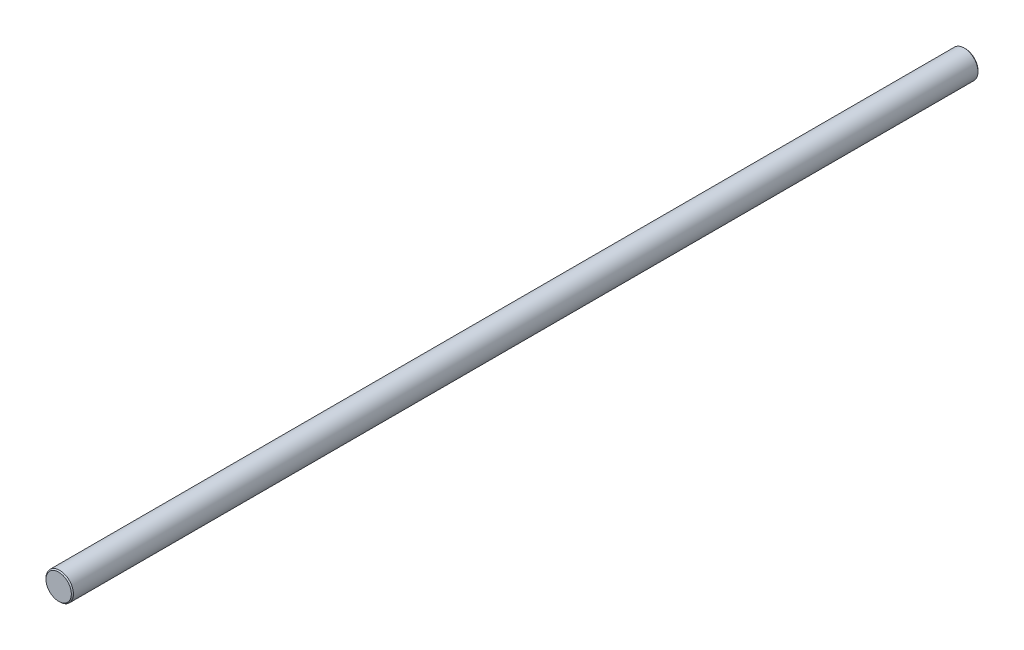
ISO-10303-21;
HEADER;
FILE_DESCRIPTION(('STEP AP214'),'2;1');
FILE_NAME('part.step','',(''),(''),'','','');
FILE_SCHEMA(('AUTOMOTIVE_DESIGN { 1 0 10303 214 1 1 1 1 }'));
ENDSEC;
DATA;
#1=APPLICATION_CONTEXT('core data for automotive mechanical design processes');
#2=APPLICATION_PROTOCOL_DEFINITION('international standard','automotive_design',2000,#1);
#3=PRODUCT_CONTEXT('',#1,'mechanical');
#4=PRODUCT('Part','Part','',(#3));
#5=PRODUCT_RELATED_PRODUCT_CATEGORY('part','',(#4));
#6=PRODUCT_DEFINITION_FORMATION('','',#4);
#7=PRODUCT_DEFINITION_CONTEXT('part definition',#1,'design');
#8=PRODUCT_DEFINITION('design','',#6,#7);
#9=PRODUCT_DEFINITION_SHAPE('','',#8);
#10=(LENGTH_UNIT() NAMED_UNIT(*) SI_UNIT(.MILLI.,.METRE.));
#11=(NAMED_UNIT(*) PLANE_ANGLE_UNIT() SI_UNIT($,.RADIAN.));
#12=(NAMED_UNIT(*) SI_UNIT($,.STERADIAN.) SOLID_ANGLE_UNIT());
#13=UNCERTAINTY_MEASURE_WITH_UNIT(LENGTH_MEASURE(1.E-05),#10,'distance_accuracy_value','');
#14=(GEOMETRIC_REPRESENTATION_CONTEXT(3) GLOBAL_UNCERTAINTY_ASSIGNED_CONTEXT((#13)) GLOBAL_UNIT_ASSIGNED_CONTEXT((#10,
#11,#12)) REPRESENTATION_CONTEXT('',''));
#15=CARTESIAN_POINT('',(0.,0.,0.));
#16=DIRECTION('',(0.,0.,1.));
#17=DIRECTION('',(1.,0.,0.));
#18=AXIS2_PLACEMENT_3D('',#15,#16,#17);
#19=CARTESIAN_POINT('',(0.,0.,330.2));
#20=DIRECTION('',(0.,0.,-1.));
#21=DIRECTION('',(-1.,0.,0.));
#22=AXIS2_PLACEMENT_3D('',#19,#20,#21);
#23=CYLINDRICAL_SURFACE('',#22,10.);
#24=CARTESIAN_POINT('',(0.,0.,-329.438));
#25=DIRECTION('',(0.,0.,1.));
#26=DIRECTION('',(1.,0.,0.));
#27=AXIS2_PLACEMENT_3D('',#24,#25,#26);
#28=CIRCLE('',#27,10.);
#29=CARTESIAN_POINT('',(10.,0.,-329.438));
#30=VERTEX_POINT('',#29);
#31=EDGE_CURVE('E41',#30,#30,#28,.T.);
#32=ORIENTED_EDGE('',*,*,#31,.T.);
#33=EDGE_LOOP('',(#32));
#34=FACE_BOUND('',#33,.T.);
#35=CARTESIAN_POINT('',(0.,0.,329.438));
#36=DIRECTION('',(0.,0.,1.));
#37=DIRECTION('',(1.,0.,0.));
#38=AXIS2_PLACEMENT_3D('',#35,#36,#37);
#39=CIRCLE('',#38,10.);
#40=CARTESIAN_POINT('',(10.,0.,329.438));
#41=VERTEX_POINT('',#40);
#42=EDGE_CURVE('E45',#41,#41,#39,.F.);
#43=ORIENTED_EDGE('',*,*,#42,.T.);
#44=EDGE_LOOP('',(#43));
#45=FACE_BOUND('',#44,.T.);
#46=ADVANCED_FACE('F30',(#34,#45),#23,.T.);
#47=CARTESIAN_POINT('',(0.,0.,330.2));
#48=DIRECTION('',(0.,0.,1.));
#49=DIRECTION('',(1.,0.,0.));
#50=AXIS2_PLACEMENT_3D('',#47,#48,#49);
#51=PLANE('',#50);
#52=CARTESIAN_POINT('',(0.,0.,330.2));
#53=DIRECTION('',(0.,0.,1.));
#54=DIRECTION('',(1.,0.,0.));
#55=AXIS2_PLACEMENT_3D('',#52,#53,#54);
#56=CIRCLE('',#55,9.23800000000002);
#57=CARTESIAN_POINT('',(9.23800000000002,0.,330.2));
#58=VERTEX_POINT('',#57);
#59=EDGE_CURVE('E10',#58,#58,#56,.T.);
#60=ORIENTED_EDGE('',*,*,#59,.T.);
#61=EDGE_LOOP('',(#60));
#62=FACE_BOUND('',#61,.T.);
#63=ADVANCED_FACE('F61',(#62),#51,.T.);
#64=CARTESIAN_POINT('',(0.,0.,-330.2));
#65=DIRECTION('',(0.,0.,1.));
#66=DIRECTION('',(1.,0.,0.));
#67=AXIS2_PLACEMENT_3D('',#64,#65,#66);
#68=PLANE('',#67);
#69=CARTESIAN_POINT('',(0.,0.,-330.2));
#70=DIRECTION('',(0.,0.,1.));
#71=DIRECTION('',(1.,0.,0.));
#72=AXIS2_PLACEMENT_3D('',#69,#70,#71);
#73=CIRCLE('',#72,9.23800000000025);
#74=CARTESIAN_POINT('',(9.23800000000025,0.,-330.2));
#75=VERTEX_POINT('',#74);
#76=EDGE_CURVE('E37',#75,#75,#73,.F.);
#77=ORIENTED_EDGE('',*,*,#76,.T.);
#78=EDGE_LOOP('',(#77));
#79=FACE_BOUND('',#78,.T.);
#80=ADVANCED_FACE('F58',(#79),#68,.F.);
#81=CARTESIAN_POINT('',(0.,0.,-329.438));
#82=DIRECTION('',(0.,0.,1.));
#83=DIRECTION('',(1.,0.,0.));
#84=AXIS2_PLACEMENT_3D('',#81,#82,#83);
#85=CONICAL_SURFACE('',#84,10.,0.785398163397406);
#86=ORIENTED_EDGE('',*,*,#76,.F.);
#87=EDGE_LOOP('',(#86));
#88=FACE_BOUND('',#87,.T.);
#89=ORIENTED_EDGE('',*,*,#31,.F.);
#90=EDGE_LOOP('',(#89));
#91=FACE_BOUND('',#90,.T.);
#92=ADVANCED_FACE('F54',(#88,#91),#85,.T.);
#93=CARTESIAN_POINT('',(0.,0.,330.2));
#94=DIRECTION('',(0.,0.,-1.));
#95=DIRECTION('',(-1.,0.,0.));
#96=AXIS2_PLACEMENT_3D('',#93,#94,#95);
#97=CONICAL_SURFACE('',#96,9.23800000000002,0.785398163397443);
#98=ORIENTED_EDGE('',*,*,#42,.F.);
#99=EDGE_LOOP('',(#98));
#100=FACE_BOUND('',#99,.T.);
#101=ORIENTED_EDGE('',*,*,#59,.F.);
#102=EDGE_LOOP('',(#101));
#103=FACE_BOUND('',#102,.T.);
#104=ADVANCED_FACE('F32',(#100,#103),#97,.T.);
#105=CLOSED_SHELL('',(#46,#63,#80,#92,#104));
#106=MANIFOLD_SOLID_BREP('B2',#105);
#107=ADVANCED_BREP_SHAPE_REPRESENTATION('',(#18,#106),#14);
#108=SHAPE_DEFINITION_REPRESENTATION(#9,#107);
ENDSEC;
END-ISO-10303-21;
